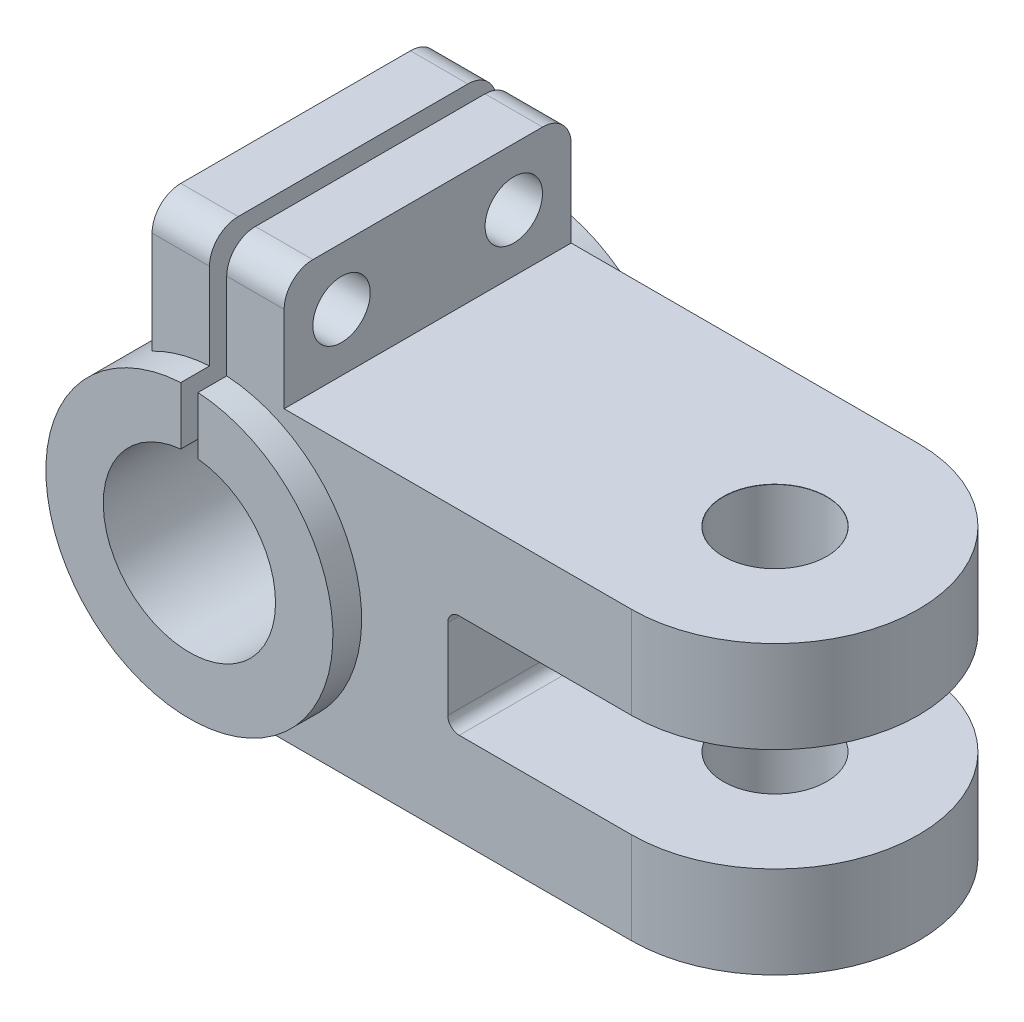
ISO-10303-21;
HEADER;
FILE_DESCRIPTION(('STEP AP214'),'2;1');
FILE_NAME('part.step','',(''),(''),'','','');
FILE_SCHEMA(('AUTOMOTIVE_DESIGN { 1 0 10303 214 1 1 1 1 }'));
ENDSEC;
DATA;
#1=APPLICATION_CONTEXT('core data for automotive mechanical design processes');
#2=APPLICATION_PROTOCOL_DEFINITION('international standard','automotive_design',2000,#1);
#3=PRODUCT_CONTEXT('',#1,'mechanical');
#4=PRODUCT('Part','Part','',(#3));
#5=PRODUCT_RELATED_PRODUCT_CATEGORY('part','',(#4));
#6=PRODUCT_DEFINITION_FORMATION('','',#4);
#7=PRODUCT_DEFINITION_CONTEXT('part definition',#1,'design');
#8=PRODUCT_DEFINITION('design','',#6,#7);
#9=PRODUCT_DEFINITION_SHAPE('','',#8);
#10=(LENGTH_UNIT() NAMED_UNIT(*) SI_UNIT(.MILLI.,.METRE.));
#11=(NAMED_UNIT(*) PLANE_ANGLE_UNIT() SI_UNIT($,.RADIAN.));
#12=(NAMED_UNIT(*) SI_UNIT($,.STERADIAN.) SOLID_ANGLE_UNIT());
#13=UNCERTAINTY_MEASURE_WITH_UNIT(LENGTH_MEASURE(1.E-05),#10,'distance_accuracy_value','');
#14=(GEOMETRIC_REPRESENTATION_CONTEXT(3) GLOBAL_UNCERTAINTY_ASSIGNED_CONTEXT((#13)) GLOBAL_UNIT_ASSIGNED_CONTEXT((#10,
#11,#12)) REPRESENTATION_CONTEXT('',''));
#15=CARTESIAN_POINT('',(0.,0.,0.));
#16=DIRECTION('',(0.,0.,1.));
#17=DIRECTION('',(1.,0.,0.));
#18=AXIS2_PLACEMENT_3D('',#15,#16,#17);
#19=CARTESIAN_POINT('',(0.,8.99999999999999,25.));
#20=DIRECTION('',(0.,-1.,0.));
#21=DIRECTION('',(1.,0.,0.));
#22=AXIS2_PLACEMENT_3D('',#19,#20,#21);
#23=PLANE('',#22);
#24=CARTESIAN_POINT('',(71.9999969609067,9.00000000000003,6.74475313169785E-07));
#25=DIRECTION('',(0.,-1.,0.));
#26=DIRECTION('',(1.,0.,0.));
#27=AXIS2_PLACEMENT_3D('',#24,#25,#26);
#28=CIRCLE('',#27,9.);
#29=CARTESIAN_POINT('',(80.9999969609067,9.00000000000004,6.74475313169785E-07));
#30=VERTEX_POINT('',#29);
#31=EDGE_CURVE('E413',#30,#30,#28,.T.);
#32=ORIENTED_EDGE('',*,*,#31,.F.);
#33=EDGE_LOOP('',(#32));
#34=FACE_BOUND('',#33,.T.);
#35=CARTESIAN_POINT('',(71.9999969609066,9.00000000000001,0.));
#36=DIRECTION('',(0.,-1.,0.));
#37=DIRECTION('',(1.,0.,0.));
#38=AXIS2_PLACEMENT_3D('',#35,#36,#37);
#39=CIRCLE('',#38,25.);
#40=CARTESIAN_POINT('',(71.9999969609066,9.00000000000003,-25.));
#41=VERTEX_POINT('',#40);
#42=CARTESIAN_POINT('',(71.9999969609066,9.00000000000003,25.));
#43=VERTEX_POINT('',#42);
#44=EDGE_CURVE('E450',#41,#43,#39,.T.);
#45=ORIENTED_EDGE('',*,*,#44,.T.);
#46=DIRECTION('',(-1.,0.,0.));
#47=VECTOR('',#46,1.);
#48=CARTESIAN_POINT('',(0.,8.99999999999999,25.));
#49=LINE('',#48,#47);
#50=CARTESIAN_POINT('',(42.,9.00000000000001,25.));
#51=VERTEX_POINT('',#50);
#52=EDGE_CURVE('E323',#43,#51,#49,.T.);
#53=ORIENTED_EDGE('',*,*,#52,.T.);
#54=DIRECTION('',(0.,0.,-1.));
#55=VECTOR('',#54,1.);
#56=CARTESIAN_POINT('',(42.,9.00000000000001,25.));
#57=LINE('',#56,#55);
#58=CARTESIAN_POINT('',(42.,9.00000000000001,-25.));
#59=VERTEX_POINT('',#58);
#60=EDGE_CURVE('E239',#51,#59,#57,.T.);
#61=ORIENTED_EDGE('',*,*,#60,.T.);
#62=DIRECTION('',(-1.,0.,0.));
#63=VECTOR('',#62,1.);
#64=CARTESIAN_POINT('',(0.,8.99999999999999,-25.));
#65=LINE('',#64,#63);
#66=EDGE_CURVE('E343',#41,#59,#65,.T.);
#67=ORIENTED_EDGE('',*,*,#66,.F.);
#68=EDGE_LOOP('',(#45,#53,#61,#67));
#69=FACE_BOUND('',#68,.T.);
#70=ADVANCED_FACE('F42',(#34,#69),#23,.T.);
#71=CARTESIAN_POINT('',(0.,25.,25.));
#72=DIRECTION('',(0.,-1.,0.));
#73=DIRECTION('',(1.,0.,0.));
#74=AXIS2_PLACEMENT_3D('',#71,#72,#73);
#75=PLANE('',#74);
#76=CARTESIAN_POINT('',(71.9999969609067,25.0000000000001,6.74475313169785E-07));
#77=DIRECTION('',(0.,1.,0.));
#78=DIRECTION('',(0.,0.,1.));
#79=AXIS2_PLACEMENT_3D('',#76,#77,#78);
#80=CIRCLE('',#79,9.02500000000001);
#81=CARTESIAN_POINT('',(71.9999969609067,25.0000000000001,9.02500067447532));
#82=VERTEX_POINT('',#81);
#83=EDGE_CURVE('E427',#82,#82,#80,.T.);
#84=ORIENTED_EDGE('',*,*,#83,.F.);
#85=EDGE_LOOP('',(#84));
#86=FACE_BOUND('',#85,.T.);
#87=CARTESIAN_POINT('',(71.9999969609066,25.0000000000001,0.));
#88=DIRECTION('',(0.,-1.,0.));
#89=DIRECTION('',(1.,0.,0.));
#90=AXIS2_PLACEMENT_3D('',#87,#88,#89);
#91=CIRCLE('',#90,25.);
#92=CARTESIAN_POINT('',(71.9999969609066,25.0000000000001,-25.));
#93=VERTEX_POINT('',#92);
#94=CARTESIAN_POINT('',(71.9999969609066,25.0000000000001,25.));
#95=VERTEX_POINT('',#94);
#96=EDGE_CURVE('E452',#93,#95,#91,.T.);
#97=ORIENTED_EDGE('',*,*,#96,.F.);
#98=DIRECTION('',(-1.,0.,0.));
#99=VECTOR('',#98,1.);
#100=CARTESIAN_POINT('',(0.,25.,-25.));
#101=LINE('',#100,#99);
#102=CARTESIAN_POINT('',(11.5,25.,-25.));
#103=VERTEX_POINT('',#102);
#104=EDGE_CURVE('E346',#93,#103,#101,.T.);
#105=ORIENTED_EDGE('',*,*,#104,.T.);
#106=DIRECTION('',(0.,0.,-1.));
#107=VECTOR('',#106,1.);
#108=CARTESIAN_POINT('',(11.5,25.,25.));
#109=LINE('',#108,#107);
#110=CARTESIAN_POINT('',(11.5,25.,25.));
#111=VERTEX_POINT('',#110);
#112=EDGE_CURVE('E244',#111,#103,#109,.T.);
#113=ORIENTED_EDGE('',*,*,#112,.F.);
#114=DIRECTION('',(-1.,0.,0.));
#115=VECTOR('',#114,1.);
#116=CARTESIAN_POINT('',(0.,25.,25.));
#117=LINE('',#116,#115);
#118=EDGE_CURVE('E317',#95,#111,#117,.T.);
#119=ORIENTED_EDGE('',*,*,#118,.F.);
#120=EDGE_LOOP('',(#97,#105,#113,#119));
#121=FACE_BOUND('',#120,.T.);
#122=ADVANCED_FACE('F473',(#86,#121),#75,.F.);
#123=CARTESIAN_POINT('',(0.,-25.,25.));
#124=DIRECTION('',(0.,1.,0.));
#125=DIRECTION('',(0.,0.,1.));
#126=AXIS2_PLACEMENT_3D('',#123,#124,#125);
#127=PLANE('',#126);
#128=CARTESIAN_POINT('',(71.9999969609067,-25.,6.74475313169785E-07));
#129=DIRECTION('',(0.,1.,0.));
#130=DIRECTION('',(0.,0.,1.));
#131=AXIS2_PLACEMENT_3D('',#128,#129,#130);
#132=CIRCLE('',#131,8.99999999999999);
#133=CARTESIAN_POINT('',(71.9999969609067,-25.,9.00000067447531));
#134=VERTEX_POINT('',#133);
#135=EDGE_CURVE('E419',#134,#134,#132,.T.);
#136=ORIENTED_EDGE('',*,*,#135,.T.);
#137=EDGE_LOOP('',(#136));
#138=FACE_BOUND('',#137,.T.);
#139=CARTESIAN_POINT('',(71.9999969609067,-25.,0.));
#140=DIRECTION('',(0.,1.,0.));
#141=DIRECTION('',(0.,0.,1.));
#142=AXIS2_PLACEMENT_3D('',#139,#140,#141);
#143=CIRCLE('',#142,25.);
#144=CARTESIAN_POINT('',(71.9999969609067,-25.,25.));
#145=VERTEX_POINT('',#144);
#146=CARTESIAN_POINT('',(71.9999969609067,-25.,-25.));
#147=VERTEX_POINT('',#146);
#148=EDGE_CURVE('E455',#145,#147,#143,.T.);
#149=ORIENTED_EDGE('',*,*,#148,.F.);
#150=DIRECTION('',(1.,0.,0.));
#151=VECTOR('',#150,1.);
#152=CARTESIAN_POINT('',(0.,-25.,25.));
#153=LINE('',#152,#151);
#154=CARTESIAN_POINT('',(0.,-25.,25.));
#155=VERTEX_POINT('',#154);
#156=EDGE_CURVE('E330',#155,#145,#153,.T.);
#157=ORIENTED_EDGE('',*,*,#156,.F.);
#158=DIRECTION('',(0.,0.,-1.));
#159=VECTOR('',#158,1.);
#160=CARTESIAN_POINT('',(0.,-25.,25.));
#161=LINE('',#160,#159);
#162=CARTESIAN_POINT('',(0.,-25.,-25.));
#163=VERTEX_POINT('',#162);
#164=EDGE_CURVE('E375',#155,#163,#161,.T.);
#165=ORIENTED_EDGE('',*,*,#164,.T.);
#166=DIRECTION('',(1.,0.,0.));
#167=VECTOR('',#166,1.);
#168=CARTESIAN_POINT('',(0.,-25.,-25.));
#169=LINE('',#168,#167);
#170=EDGE_CURVE('E357',#163,#147,#169,.T.);
#171=ORIENTED_EDGE('',*,*,#170,.T.);
#172=EDGE_LOOP('',(#149,#157,#165,#171));
#173=FACE_BOUND('',#172,.T.);
#174=ADVANCED_FACE('F491',(#138,#173),#127,.F.);
#175=CARTESIAN_POINT('',(0.,-8.99999999999997,25.));
#176=DIRECTION('',(0.,-1.,0.));
#177=DIRECTION('',(1.,0.,0.));
#178=AXIS2_PLACEMENT_3D('',#175,#176,#177);
#179=PLANE('',#178);
#180=CARTESIAN_POINT('',(71.9999969609067,-8.99999999999996,6.74475313169785E-07));
#181=DIRECTION('',(0.,-1.,0.));
#182=DIRECTION('',(1.,0.,0.));
#183=AXIS2_PLACEMENT_3D('',#180,#181,#182);
#184=CIRCLE('',#183,9.);
#185=CARTESIAN_POINT('',(80.9999969609067,-8.99999999999996,6.74475313169785E-07));
#186=VERTEX_POINT('',#185);
#187=EDGE_CURVE('E415',#186,#186,#184,.T.);
#188=ORIENTED_EDGE('',*,*,#187,.T.);
#189=EDGE_LOOP('',(#188));
#190=FACE_BOUND('',#189,.T.);
#191=CARTESIAN_POINT('',(71.9999969609066,-8.99999999999995,0.));
#192=DIRECTION('',(0.,-1.,0.));
#193=DIRECTION('',(1.,0.,0.));
#194=AXIS2_PLACEMENT_3D('',#191,#192,#193);
#195=CIRCLE('',#194,25.);
#196=CARTESIAN_POINT('',(71.9999969609066,-8.99999999999996,-25.));
#197=VERTEX_POINT('',#196);
#198=CARTESIAN_POINT('',(71.9999969609066,-8.99999999999996,25.));
#199=VERTEX_POINT('',#198);
#200=EDGE_CURVE('E457',#197,#199,#195,.T.);
#201=ORIENTED_EDGE('',*,*,#200,.F.);
#202=DIRECTION('',(-1.,0.,0.));
#203=VECTOR('',#202,1.);
#204=CARTESIAN_POINT('',(0.,-8.99999999999997,-25.));
#205=LINE('',#204,#203);
#206=CARTESIAN_POINT('',(42.,-8.99999999999996,-25.));
#207=VERTEX_POINT('',#206);
#208=EDGE_CURVE('E360',#197,#207,#205,.T.);
#209=ORIENTED_EDGE('',*,*,#208,.T.);
#210=DIRECTION('',(0.,0.,-1.));
#211=VECTOR('',#210,1.);
#212=CARTESIAN_POINT('',(42.,-8.99999999999996,25.));
#213=LINE('',#212,#211);
#214=CARTESIAN_POINT('',(42.,-8.99999999999996,25.));
#215=VERTEX_POINT('',#214);
#216=EDGE_CURVE('E372',#215,#207,#213,.T.);
#217=ORIENTED_EDGE('',*,*,#216,.F.);
#218=DIRECTION('',(-1.,0.,0.));
#219=VECTOR('',#218,1.);
#220=CARTESIAN_POINT('',(0.,-8.99999999999997,25.));
#221=LINE('',#220,#219);
#222=EDGE_CURVE('E333',#199,#215,#221,.T.);
#223=ORIENTED_EDGE('',*,*,#222,.F.);
#224=EDGE_LOOP('',(#201,#209,#217,#223));
#225=FACE_BOUND('',#224,.T.);
#226=ADVANCED_FACE('F560',(#190,#225),#179,.F.);
#227=CARTESIAN_POINT('',(0.,45.,25.));
#228=DIRECTION('',(0.,1.,0.));
#229=DIRECTION('',(-1.,0.,0.));
#230=AXIS2_PLACEMENT_3D('',#227,#228,#229);
#231=PLANE('',#230);
#232=DIRECTION('',(0.,0.,1.));
#233=VECTOR('',#232,1.);
#234=CARTESIAN_POINT('',(-1.5,45.,-30.));
#235=LINE('',#234,#233);
#236=CARTESIAN_POINT('',(-1.5,45.,-20.));
#237=VERTEX_POINT('',#236);
#238=CARTESIAN_POINT('',(-1.5,45.,20.));
#239=VERTEX_POINT('',#238);
#240=EDGE_CURVE('E306',#237,#239,#235,.T.);
#241=ORIENTED_EDGE('',*,*,#240,.F.);
#242=DIRECTION('',(1.,0.,0.));
#243=VECTOR('',#242,1.);
#244=CARTESIAN_POINT('',(-11.5,45.,-20.));
#245=LINE('',#244,#243);
#246=CARTESIAN_POINT('',(-11.5,45.,-20.));
#247=VERTEX_POINT('',#246);
#248=EDGE_CURVE('E276',#237,#247,#245,.F.);
#249=ORIENTED_EDGE('',*,*,#248,.T.);
#250=DIRECTION('',(0.,0.,-1.));
#251=VECTOR('',#250,1.);
#252=CARTESIAN_POINT('',(-11.5,45.,25.));
#253=LINE('',#252,#251);
#254=CARTESIAN_POINT('',(-11.5,45.,20.));
#255=VERTEX_POINT('',#254);
#256=EDGE_CURVE('E381',#255,#247,#253,.T.);
#257=ORIENTED_EDGE('',*,*,#256,.F.);
#258=DIRECTION('',(1.,0.,0.));
#259=VECTOR('',#258,1.);
#260=CARTESIAN_POINT('',(0.,45.,20.));
#261=LINE('',#260,#259);
#262=EDGE_CURVE('E273',#255,#239,#261,.T.);
#263=ORIENTED_EDGE('',*,*,#262,.T.);
#264=EDGE_LOOP('',(#241,#249,#257,#263));
#265=FACE_BOUND('',#264,.T.);
#266=ADVANCED_FACE('F528',(#265),#231,.T.);
#267=CARTESIAN_POINT('',(0.,0.,25.));
#268=DIRECTION('',(0.,0.,1.));
#269=DIRECTION('',(1.,0.,0.));
#270=AXIS2_PLACEMENT_3D('',#267,#268,#269);
#271=PLANE('',#270);
#272=DIRECTION('',(0.,-1.,0.));
#273=VECTOR('',#272,1.);
#274=CARTESIAN_POINT('',(-1.5,0.,25.));
#275=LINE('',#274,#273);
#276=CARTESIAN_POINT('',(-1.5,40.,25.));
#277=VERTEX_POINT('',#276);
#278=CARTESIAN_POINT('',(-1.5,24.9549594269356,25.));
#279=VERTEX_POINT('',#278);
#280=EDGE_CURVE('E401',#277,#279,#275,.T.);
#281=ORIENTED_EDGE('',*,*,#280,.F.);
#282=DIRECTION('',(1.,0.,0.));
#283=VECTOR('',#282,1.);
#284=CARTESIAN_POINT('',(0.,40.,25.));
#285=LINE('',#284,#283);
#286=CARTESIAN_POINT('',(-11.5,40.,25.));
#287=VERTEX_POINT('',#286);
#288=EDGE_CURVE('E282',#277,#287,#285,.F.);
#289=ORIENTED_EDGE('',*,*,#288,.T.);
#290=DIRECTION('',(0.,-1.,0.));
#291=VECTOR('',#290,1.);
#292=CARTESIAN_POINT('',(-11.5,0.,25.));
#293=LINE('',#292,#291);
#294=CARTESIAN_POINT('',(-11.5,22.1979728804231,25.));
#295=VERTEX_POINT('',#294);
#296=EDGE_CURVE('E319',#287,#295,#293,.T.);
#297=ORIENTED_EDGE('',*,*,#296,.T.);
#298=CARTESIAN_POINT('',(0.,0.,25.));
#299=DIRECTION('',(0.,0.,1.));
#300=DIRECTION('',(1.,0.,0.));
#301=AXIS2_PLACEMENT_3D('',#298,#299,#300);
#302=CIRCLE('',#301,25.);
#303=EDGE_CURVE('E321',#279,#295,#302,.T.);
#304=ORIENTED_EDGE('',*,*,#303,.F.);
#305=EDGE_LOOP('',(#281,#289,#297,#304));
#306=FACE_BOUND('',#305,.T.);
#307=ADVANCED_FACE('F537',(#306),#271,.T.);
#308=CARTESIAN_POINT('',(0.,0.,-25.));
#309=DIRECTION('',(0.,0.,1.));
#310=DIRECTION('',(1.,0.,0.));
#311=AXIS2_PLACEMENT_3D('',#308,#309,#310);
#312=PLANE('',#311);
#313=DIRECTION('',(0.,-1.,0.));
#314=VECTOR('',#313,1.);
#315=CARTESIAN_POINT('',(-11.5,0.,-25.));
#316=LINE('',#315,#314);
#317=CARTESIAN_POINT('',(-11.5,40.,-25.));
#318=VERTEX_POINT('',#317);
#319=CARTESIAN_POINT('',(-11.5,22.1979728804231,-25.));
#320=VERTEX_POINT('',#319);
#321=EDGE_CURVE('E351',#318,#320,#316,.T.);
#322=ORIENTED_EDGE('',*,*,#321,.F.);
#323=DIRECTION('',(1.,0.,0.));
#324=VECTOR('',#323,1.);
#325=CARTESIAN_POINT('',(-1.5,40.,-25.));
#326=LINE('',#325,#324);
#327=CARTESIAN_POINT('',(-1.5,40.,-25.));
#328=VERTEX_POINT('',#327);
#329=EDGE_CURVE('E265',#318,#328,#326,.T.);
#330=ORIENTED_EDGE('',*,*,#329,.T.);
#331=DIRECTION('',(0.,-1.,0.));
#332=VECTOR('',#331,1.);
#333=CARTESIAN_POINT('',(-1.5,0.,-25.));
#334=LINE('',#333,#332);
#335=CARTESIAN_POINT('',(-1.5,24.9549594269356,-25.));
#336=VERTEX_POINT('',#335);
#337=EDGE_CURVE('E252',#328,#336,#334,.T.);
#338=ORIENTED_EDGE('',*,*,#337,.T.);
#339=CARTESIAN_POINT('',(0.,0.,-25.));
#340=DIRECTION('',(0.,0.,1.));
#341=DIRECTION('',(1.,0.,0.));
#342=AXIS2_PLACEMENT_3D('',#339,#340,#341);
#343=CIRCLE('',#342,25.);
#344=EDGE_CURVE('E353',#336,#320,#343,.T.);
#345=ORIENTED_EDGE('',*,*,#344,.T.);
#346=EDGE_LOOP('',(#322,#330,#338,#345));
#347=FACE_BOUND('',#346,.T.);
#348=ADVANCED_FACE('F509',(#347),#312,.F.);
#349=CARTESIAN_POINT('',(0.,0.,30.));
#350=DIRECTION('',(0.,0.,-1.));
#351=DIRECTION('',(-1.,0.,0.));
#352=AXIS2_PLACEMENT_3D('',#349,#350,#351);
#353=CYLINDRICAL_SURFACE('',#352,15.);
#354=DIRECTION('',(0.,0.,1.));
#355=VECTOR('',#354,1.);
#356=CARTESIAN_POINT('',(1.5,14.9248115565993,-30.));
#357=LINE('',#356,#355);
#358=CARTESIAN_POINT('',(1.5,14.9248115565993,-30.));
#359=VERTEX_POINT('',#358);
#360=CARTESIAN_POINT('',(1.5,14.9248115565993,30.));
#361=VERTEX_POINT('',#360);
#362=EDGE_CURVE('E224',#359,#361,#357,.T.);
#363=ORIENTED_EDGE('',*,*,#362,.F.);
#364=CARTESIAN_POINT('',(0.,0.,-30.));
#365=DIRECTION('',(0.,0.,1.));
#366=DIRECTION('',(1.,0.,0.));
#367=AXIS2_PLACEMENT_3D('',#364,#365,#366);
#368=CIRCLE('',#367,15.);
#369=CARTESIAN_POINT('',(-1.5,14.9248115565993,-30.));
#370=VERTEX_POINT('',#369);
#371=EDGE_CURVE('E232',#370,#359,#368,.T.);
#372=ORIENTED_EDGE('',*,*,#371,.F.);
#373=DIRECTION('',(0.,0.,1.));
#374=VECTOR('',#373,1.);
#375=CARTESIAN_POINT('',(-1.5,14.9248115565993,-30.));
#376=LINE('',#375,#374);
#377=CARTESIAN_POINT('',(-1.5,14.9248115565993,30.));
#378=VERTEX_POINT('',#377);
#379=EDGE_CURVE('E211',#370,#378,#376,.T.);
#380=ORIENTED_EDGE('',*,*,#379,.T.);
#381=CARTESIAN_POINT('',(0.,0.,30.));
#382=DIRECTION('',(0.,0.,1.));
#383=DIRECTION('',(1.,0.,0.));
#384=AXIS2_PLACEMENT_3D('',#381,#382,#383);
#385=CIRCLE('',#384,15.);
#386=EDGE_CURVE('E241',#378,#361,#385,.T.);
#387=ORIENTED_EDGE('',*,*,#386,.T.);
#388=EDGE_LOOP('',(#363,#372,#380,#387));
#389=FACE_BOUND('',#388,.T.);
#390=ADVANCED_FACE('F238',(#389),#353,.F.);
#391=CARTESIAN_POINT('',(0.,0.,30.));
#392=DIRECTION('',(0.,0.,-1.));
#393=DIRECTION('',(-1.,0.,0.));
#394=AXIS2_PLACEMENT_3D('',#391,#392,#393);
#395=CYLINDRICAL_SURFACE('',#394,25.);
#396=CARTESIAN_POINT('',(0.,0.,30.));
#397=DIRECTION('',(0.,0.,1.));
#398=DIRECTION('',(1.,0.,0.));
#399=AXIS2_PLACEMENT_3D('',#396,#397,#398);
#400=CIRCLE('',#399,25.);
#401=CARTESIAN_POINT('',(-1.5,24.9549594269356,30.));
#402=VERTEX_POINT('',#401);
#403=CARTESIAN_POINT('',(1.5,24.9549594269356,30.));
#404=VERTEX_POINT('',#403);
#405=EDGE_CURVE('E247',#402,#404,#400,.T.);
#406=ORIENTED_EDGE('',*,*,#405,.F.);
#407=DIRECTION('',(0.,0.,-1.));
#408=VECTOR('',#407,1.);
#409=CARTESIAN_POINT('',(-1.5,24.9549594269356,30.));
#410=LINE('',#409,#408);
#411=EDGE_CURVE('E344',#402,#279,#410,.T.);
#412=ORIENTED_EDGE('',*,*,#411,.T.);
#413=ORIENTED_EDGE('',*,*,#303,.T.);
#414=DIRECTION('',(0.,0.,-1.));
#415=VECTOR('',#414,1.);
#416=CARTESIAN_POINT('',(-11.5,22.1979728804231,25.));
#417=LINE('',#416,#415);
#418=EDGE_CURVE('E378',#295,#320,#417,.T.);
#419=ORIENTED_EDGE('',*,*,#418,.T.);
#420=ORIENTED_EDGE('',*,*,#344,.F.);
#421=CARTESIAN_POINT('',(-1.5,24.9549594269356,-30.));
#422=VERTEX_POINT('',#421);
#423=EDGE_CURVE('E398',#336,#422,#410,.T.);
#424=ORIENTED_EDGE('',*,*,#423,.T.);
#425=CARTESIAN_POINT('',(0.,0.,-30.));
#426=DIRECTION('',(0.,0.,1.));
#427=DIRECTION('',(1.,0.,0.));
#428=AXIS2_PLACEMENT_3D('',#425,#426,#427);
#429=CIRCLE('',#428,25.);
#430=CARTESIAN_POINT('',(1.5,24.9549594269356,-30.));
#431=VERTEX_POINT('',#430);
#432=EDGE_CURVE('E234',#422,#431,#429,.T.);
#433=ORIENTED_EDGE('',*,*,#432,.T.);
#434=DIRECTION('',(0.,0.,-1.));
#435=VECTOR('',#434,1.);
#436=CARTESIAN_POINT('',(1.5,24.9549594269356,30.));
#437=LINE('',#436,#435);
#438=CARTESIAN_POINT('',(1.5,24.9549594269356,-25.));
#439=VERTEX_POINT('',#438);
#440=EDGE_CURVE('E400',#431,#439,#437,.F.);
#441=ORIENTED_EDGE('',*,*,#440,.T.);
#442=EDGE_CURVE('E354',#163,#439,#343,.T.);
#443=ORIENTED_EDGE('',*,*,#442,.F.);
#444=ORIENTED_EDGE('',*,*,#164,.F.);
#445=CARTESIAN_POINT('',(1.5,24.9549594269356,25.));
#446=VERTEX_POINT('',#445);
#447=EDGE_CURVE('E327',#155,#446,#302,.T.);
#448=ORIENTED_EDGE('',*,*,#447,.T.);
#449=EDGE_CURVE('E396',#446,#404,#437,.F.);
#450=ORIENTED_EDGE('',*,*,#449,.T.);
#451=EDGE_LOOP('',(#406,#412,#413,#419,#420,#424,#433,#441,#443,#444,#448,#450));
#452=FACE_BOUND('',#451,.T.);
#453=ADVANCED_FACE('F393',(#452),#395,.T.);
#454=CARTESIAN_POINT('',(0.,0.,30.));
#455=DIRECTION('',(0.,0.,1.));
#456=DIRECTION('',(1.,0.,0.));
#457=AXIS2_PLACEMENT_3D('',#454,#455,#456);
#458=PLANE('',#457);
#459=DIRECTION('',(0.,-1.,0.));
#460=VECTOR('',#459,1.);
#461=CARTESIAN_POINT('',(-1.5,45.,30.));
#462=LINE('',#461,#460);
#463=EDGE_CURVE('E219',#402,#378,#462,.T.);
#464=ORIENTED_EDGE('',*,*,#463,.F.);
#465=ORIENTED_EDGE('',*,*,#405,.T.);
#466=DIRECTION('',(0.,1.,0.));
#467=VECTOR('',#466,1.);
#468=CARTESIAN_POINT('',(1.5,45.,30.));
#469=LINE('',#468,#467);
#470=EDGE_CURVE('E235',#361,#404,#469,.T.);
#471=ORIENTED_EDGE('',*,*,#470,.F.);
#472=ORIENTED_EDGE('',*,*,#386,.F.);
#473=EDGE_LOOP('',(#464,#465,#471,#472));
#474=FACE_BOUND('',#473,.T.);
#475=ADVANCED_FACE('F389',(#474),#458,.T.);
#476=CARTESIAN_POINT('',(0.,0.,-30.));
#477=DIRECTION('',(0.,0.,1.));
#478=DIRECTION('',(1.,0.,0.));
#479=AXIS2_PLACEMENT_3D('',#476,#477,#478);
#480=PLANE('',#479);
#481=ORIENTED_EDGE('',*,*,#432,.F.);
#482=DIRECTION('',(0.,-1.,0.));
#483=VECTOR('',#482,1.);
#484=CARTESIAN_POINT('',(-1.5,45.,-30.));
#485=LINE('',#484,#483);
#486=EDGE_CURVE('E216',#422,#370,#485,.T.);
#487=ORIENTED_EDGE('',*,*,#486,.T.);
#488=ORIENTED_EDGE('',*,*,#371,.T.);
#489=DIRECTION('',(0.,1.,0.));
#490=VECTOR('',#489,1.);
#491=CARTESIAN_POINT('',(1.5,45.,-30.));
#492=LINE('',#491,#490);
#493=EDGE_CURVE('E225',#359,#431,#492,.T.);
#494=ORIENTED_EDGE('',*,*,#493,.T.);
#495=EDGE_LOOP('',(#481,#487,#488,#494));
#496=FACE_BOUND('',#495,.T.);
#497=ADVANCED_FACE('F230',(#496),#480,.F.);
#498=CARTESIAN_POINT('',(42.,7.00000000000002,25.));
#499=DIRECTION('',(0.,0.,-1.));
#500=DIRECTION('',(-1.,0.,0.));
#501=AXIS2_PLACEMENT_3D('',#498,#499,#500);
#502=CYLINDRICAL_SURFACE('',#501,2.);
#503=CARTESIAN_POINT('',(42.,7.00000000000002,-25.));
#504=DIRECTION('',(0.,0.,1.));
#505=DIRECTION('',(1.,0.,0.));
#506=AXIS2_PLACEMENT_3D('',#503,#504,#505);
#507=CIRCLE('',#506,2.);
#508=CARTESIAN_POINT('',(40.,7.00000000000002,-25.));
#509=VERTEX_POINT('',#508);
#510=EDGE_CURVE('E340',#59,#509,#507,.T.);
#511=ORIENTED_EDGE('',*,*,#510,.F.);
#512=ORIENTED_EDGE('',*,*,#60,.F.);
#513=CARTESIAN_POINT('',(42.,7.00000000000002,25.));
#514=DIRECTION('',(0.,0.,1.));
#515=DIRECTION('',(1.,0.,0.));
#516=AXIS2_PLACEMENT_3D('',#513,#514,#515);
#517=CIRCLE('',#516,2.);
#518=CARTESIAN_POINT('',(40.,7.00000000000002,25.));
#519=VERTEX_POINT('',#518);
#520=EDGE_CURVE('E367',#51,#519,#517,.T.);
#521=ORIENTED_EDGE('',*,*,#520,.T.);
#522=DIRECTION('',(0.,0.,-1.));
#523=VECTOR('',#522,1.);
#524=CARTESIAN_POINT('',(40.,7.00000000000002,25.));
#525=LINE('',#524,#523);
#526=EDGE_CURVE('E339',#519,#509,#525,.T.);
#527=ORIENTED_EDGE('',*,*,#526,.T.);
#528=EDGE_LOOP('',(#511,#512,#521,#527));
#529=FACE_BOUND('',#528,.T.);
#530=ADVANCED_FACE('F497',(#529),#502,.F.);
#531=CARTESIAN_POINT('',(11.5,0.,25.));
#532=DIRECTION('',(1.,0.,0.));
#533=DIRECTION('',(0.,1.,0.));
#534=AXIS2_PLACEMENT_3D('',#531,#532,#533);
#535=PLANE('',#534);
#536=CARTESIAN_POINT('',(11.5,35.,-15.));
#537=DIRECTION('',(1.,0.,0.));
#538=DIRECTION('',(0.,1.,0.));
#539=AXIS2_PLACEMENT_3D('',#536,#537,#538);
#540=CIRCLE('',#539,4.99999999999999);
#541=CARTESIAN_POINT('',(11.5,40.,-15.));
#542=VERTEX_POINT('',#541);
#543=EDGE_CURVE('E260',#542,#542,#540,.T.);
#544=ORIENTED_EDGE('',*,*,#543,.F.);
#545=EDGE_LOOP('',(#544));
#546=FACE_BOUND('',#545,.T.);
#547=CARTESIAN_POINT('',(11.5,35.,15.));
#548=DIRECTION('',(1.,0.,0.));
#549=DIRECTION('',(0.,1.,0.));
#550=AXIS2_PLACEMENT_3D('',#547,#548,#549);
#551=CIRCLE('',#550,4.99999999999999);
#552=CARTESIAN_POINT('',(11.5,40.,15.));
#553=VERTEX_POINT('',#552);
#554=EDGE_CURVE('E430',#553,#553,#551,.T.);
#555=ORIENTED_EDGE('',*,*,#554,.F.);
#556=EDGE_LOOP('',(#555));
#557=FACE_BOUND('',#556,.T.);
#558=DIRECTION('',(0.,0.,-1.));
#559=VECTOR('',#558,1.);
#560=CARTESIAN_POINT('',(11.5,45.,25.));
#561=LINE('',#560,#559);
#562=CARTESIAN_POINT('',(11.5,45.,20.));
#563=VERTEX_POINT('',#562);
#564=CARTESIAN_POINT('',(11.5,45.,-20.));
#565=VERTEX_POINT('',#564);
#566=EDGE_CURVE('E314',#563,#565,#561,.T.);
#567=ORIENTED_EDGE('',*,*,#566,.F.);
#568=CARTESIAN_POINT('',(11.5,40.,20.));
#569=DIRECTION('',(1.,0.,0.));
#570=DIRECTION('',(0.,1.,0.));
#571=AXIS2_PLACEMENT_3D('',#568,#569,#570);
#572=CIRCLE('',#571,5.);
#573=CARTESIAN_POINT('',(11.5,40.,25.));
#574=VERTEX_POINT('',#573);
#575=EDGE_CURVE('E291',#563,#574,#572,.T.);
#576=ORIENTED_EDGE('',*,*,#575,.T.);
#577=DIRECTION('',(0.,-1.,0.));
#578=VECTOR('',#577,1.);
#579=CARTESIAN_POINT('',(11.5,0.,25.));
#580=LINE('',#579,#578);
#581=EDGE_CURVE('E312',#574,#111,#580,.T.);
#582=ORIENTED_EDGE('',*,*,#581,.T.);
#583=ORIENTED_EDGE('',*,*,#112,.T.);
#584=DIRECTION('',(0.,-1.,0.));
#585=VECTOR('',#584,1.);
#586=CARTESIAN_POINT('',(11.5,0.,-25.));
#587=LINE('',#586,#585);
#588=CARTESIAN_POINT('',(11.5,40.,-25.));
#589=VERTEX_POINT('',#588);
#590=EDGE_CURVE('E349',#589,#103,#587,.T.);
#591=ORIENTED_EDGE('',*,*,#590,.F.);
#592=CARTESIAN_POINT('',(11.5,40.,-20.));
#593=DIRECTION('',(1.,0.,0.));
#594=DIRECTION('',(0.,1.,0.));
#595=AXIS2_PLACEMENT_3D('',#592,#593,#594);
#596=CIRCLE('',#595,5.);
#597=EDGE_CURVE('E289',#589,#565,#596,.T.);
#598=ORIENTED_EDGE('',*,*,#597,.T.);
#599=EDGE_LOOP('',(#567,#576,#582,#583,#591,#598));
#600=FACE_BOUND('',#599,.T.);
#601=ADVANCED_FACE('F310',(#546,#557,#600),#535,.T.);
#602=DIRECTION('',(0.,0.,1.));
#603=VECTOR('',#602,1.);
#604=CARTESIAN_POINT('',(1.5,45.,-30.));
#605=LINE('',#604,#603);
#606=CARTESIAN_POINT('',(1.5,45.,-20.));
#607=VERTEX_POINT('',#606);
#608=CARTESIAN_POINT('',(1.5,45.,20.));
#609=VERTEX_POINT('',#608);
#610=EDGE_CURVE('E297',#607,#609,#605,.T.);
#611=ORIENTED_EDGE('',*,*,#610,.T.);
#612=DIRECTION('',(1.,0.,0.));
#613=VECTOR('',#612,1.);
#614=CARTESIAN_POINT('',(0.,45.,20.));
#615=LINE('',#614,#613);
#616=EDGE_CURVE('E286',#609,#563,#615,.T.);
#617=ORIENTED_EDGE('',*,*,#616,.T.);
#618=ORIENTED_EDGE('',*,*,#566,.T.);
#619=DIRECTION('',(1.,0.,0.));
#620=VECTOR('',#619,1.);
#621=CARTESIAN_POINT('',(1.5,45.,-20.));
#622=LINE('',#621,#620);
#623=EDGE_CURVE('E284',#565,#607,#622,.F.);
#624=ORIENTED_EDGE('',*,*,#623,.T.);
#625=EDGE_LOOP('',(#611,#617,#618,#624));
#626=FACE_BOUND('',#625,.T.);
#627=ADVANCED_FACE('F302',(#626),#231,.T.);
#628=CARTESIAN_POINT('',(-11.5,0.,25.));
#629=DIRECTION('',(1.,0.,0.));
#630=DIRECTION('',(0.,0.,-1.));
#631=AXIS2_PLACEMENT_3D('',#628,#629,#630);
#632=PLANE('',#631);
#633=CARTESIAN_POINT('',(-11.5,35.,-15.));
#634=DIRECTION('',(-1.,0.,0.));
#635=DIRECTION('',(0.,0.,1.));
#636=AXIS2_PLACEMENT_3D('',#633,#634,#635);
#637=CIRCLE('',#636,5.025);
#638=CARTESIAN_POINT('',(-11.5,35.,-9.975));
#639=VERTEX_POINT('',#638);
#640=EDGE_CURVE('E447',#639,#639,#637,.T.);
#641=ORIENTED_EDGE('',*,*,#640,.F.);
#642=EDGE_LOOP('',(#641));
#643=FACE_BOUND('',#642,.T.);
#644=CARTESIAN_POINT('',(-11.5,35.,15.));
#645=DIRECTION('',(-1.,0.,0.));
#646=DIRECTION('',(0.,0.,1.));
#647=AXIS2_PLACEMENT_3D('',#644,#645,#646);
#648=CIRCLE('',#647,5.025);
#649=CARTESIAN_POINT('',(-11.5,35.,20.025));
#650=VERTEX_POINT('',#649);
#651=EDGE_CURVE('E437',#650,#650,#648,.T.);
#652=ORIENTED_EDGE('',*,*,#651,.F.);
#653=EDGE_LOOP('',(#652));
#654=FACE_BOUND('',#653,.T.);
#655=ORIENTED_EDGE('',*,*,#256,.T.);
#656=CARTESIAN_POINT('',(-11.5,40.,-20.));
#657=DIRECTION('',(1.,0.,0.));
#658=DIRECTION('',(0.,0.,-1.));
#659=AXIS2_PLACEMENT_3D('',#656,#657,#658);
#660=CIRCLE('',#659,5.);
#661=EDGE_CURVE('E280',#247,#318,#660,.F.);
#662=ORIENTED_EDGE('',*,*,#661,.T.);
#663=ORIENTED_EDGE('',*,*,#321,.T.);
#664=ORIENTED_EDGE('',*,*,#418,.F.);
#665=ORIENTED_EDGE('',*,*,#296,.F.);
#666=CARTESIAN_POINT('',(-11.5,40.,20.));
#667=DIRECTION('',(1.,0.,0.));
#668=DIRECTION('',(0.,0.,-1.));
#669=AXIS2_PLACEMENT_3D('',#666,#667,#668);
#670=CIRCLE('',#669,5.);
#671=EDGE_CURVE('E278',#287,#255,#670,.F.);
#672=ORIENTED_EDGE('',*,*,#671,.T.);
#673=EDGE_LOOP('',(#655,#662,#663,#664,#665,#672));
#674=FACE_BOUND('',#673,.T.);
#675=ADVANCED_FACE('F524',(#643,#654,#674),#632,.F.);
#676=CARTESIAN_POINT('',(42.,-6.99999999999996,25.));
#677=DIRECTION('',(0.,0.,-1.));
#678=DIRECTION('',(-1.,0.,0.));
#679=AXIS2_PLACEMENT_3D('',#676,#677,#678);
#680=CYLINDRICAL_SURFACE('',#679,2.);
#681=CARTESIAN_POINT('',(42.,-6.99999999999996,-25.));
#682=DIRECTION('',(0.,0.,1.));
#683=DIRECTION('',(1.,0.,0.));
#684=AXIS2_PLACEMENT_3D('',#681,#682,#683);
#685=CIRCLE('',#684,2.);
#686=CARTESIAN_POINT('',(40.,-6.99999999999996,-25.));
#687=VERTEX_POINT('',#686);
#688=EDGE_CURVE('E362',#207,#687,#685,.F.);
#689=ORIENTED_EDGE('',*,*,#688,.T.);
#690=DIRECTION('',(0.,0.,-1.));
#691=VECTOR('',#690,1.);
#692=CARTESIAN_POINT('',(40.,-6.99999999999996,25.));
#693=LINE('',#692,#691);
#694=CARTESIAN_POINT('',(40.,-6.99999999999996,25.));
#695=VERTEX_POINT('',#694);
#696=EDGE_CURVE('E369',#695,#687,#693,.T.);
#697=ORIENTED_EDGE('',*,*,#696,.F.);
#698=CARTESIAN_POINT('',(42.,-6.99999999999996,25.));
#699=DIRECTION('',(0.,0.,1.));
#700=DIRECTION('',(1.,0.,0.));
#701=AXIS2_PLACEMENT_3D('',#698,#699,#700);
#702=CIRCLE('',#701,2.);
#703=EDGE_CURVE('E335',#215,#695,#702,.F.);
#704=ORIENTED_EDGE('',*,*,#703,.F.);
#705=ORIENTED_EDGE('',*,*,#216,.T.);
#706=EDGE_LOOP('',(#689,#697,#704,#705));
#707=FACE_BOUND('',#706,.T.);
#708=ADVANCED_FACE('F556',(#707),#680,.F.);
#709=CARTESIAN_POINT('',(40.,0.,25.));
#710=DIRECTION('',(-1.,0.,0.));
#711=DIRECTION('',(0.,-1.,0.));
#712=AXIS2_PLACEMENT_3D('',#709,#710,#711);
#713=PLANE('',#712);
#714=DIRECTION('',(0.,1.,0.));
#715=VECTOR('',#714,1.);
#716=CARTESIAN_POINT('',(40.,0.,-25.));
#717=LINE('',#716,#715);
#718=EDGE_CURVE('E364',#687,#509,#717,.T.);
#719=ORIENTED_EDGE('',*,*,#718,.T.);
#720=ORIENTED_EDGE('',*,*,#526,.F.);
#721=DIRECTION('',(0.,1.,0.));
#722=VECTOR('',#721,1.);
#723=CARTESIAN_POINT('',(40.,0.,25.));
#724=LINE('',#723,#722);
#725=EDGE_CURVE('E337',#695,#519,#724,.T.);
#726=ORIENTED_EDGE('',*,*,#725,.F.);
#727=ORIENTED_EDGE('',*,*,#696,.T.);
#728=EDGE_LOOP('',(#719,#720,#726,#727));
#729=FACE_BOUND('',#728,.T.);
#730=ADVANCED_FACE('F549',(#729),#713,.F.);
#731=ORIENTED_EDGE('',*,*,#581,.F.);
#732=DIRECTION('',(1.,0.,0.));
#733=VECTOR('',#732,1.);
#734=CARTESIAN_POINT('',(0.,40.,25.));
#735=LINE('',#734,#733);
#736=CARTESIAN_POINT('',(1.5,40.,25.));
#737=VERTEX_POINT('',#736);
#738=EDGE_CURVE('E65',#574,#737,#735,.F.);
#739=ORIENTED_EDGE('',*,*,#738,.T.);
#740=DIRECTION('',(0.,1.,0.));
#741=VECTOR('',#740,1.);
#742=CARTESIAN_POINT('',(1.5,0.,25.));
#743=LINE('',#742,#741);
#744=EDGE_CURVE('E298',#446,#737,#743,.T.);
#745=ORIENTED_EDGE('',*,*,#744,.F.);
#746=ORIENTED_EDGE('',*,*,#447,.F.);
#747=ORIENTED_EDGE('',*,*,#156,.T.);
#748=DIRECTION('',(0.,-1.,0.));
#749=VECTOR('',#748,1.);
#750=CARTESIAN_POINT('',(71.9999969609066,241.147848536153,25.));
#751=LINE('',#750,#749);
#752=EDGE_CURVE('E462',#199,#145,#751,.T.);
#753=ORIENTED_EDGE('',*,*,#752,.F.);
#754=ORIENTED_EDGE('',*,*,#222,.T.);
#755=ORIENTED_EDGE('',*,*,#703,.T.);
#756=ORIENTED_EDGE('',*,*,#725,.T.);
#757=ORIENTED_EDGE('',*,*,#520,.F.);
#758=ORIENTED_EDGE('',*,*,#52,.F.);
#759=EDGE_CURVE('E460',#95,#43,#751,.T.);
#760=ORIENTED_EDGE('',*,*,#759,.F.);
#761=ORIENTED_EDGE('',*,*,#118,.T.);
#762=EDGE_LOOP('',(#731,#739,#745,#746,#747,#753,#754,#755,#756,#757,#758,#760,#761));
#763=FACE_BOUND('',#762,.T.);
#764=ADVANCED_FACE('F315',(#763),#271,.T.);
#765=DIRECTION('',(0.,1.,0.));
#766=VECTOR('',#765,1.);
#767=CARTESIAN_POINT('',(1.5,0.,-25.));
#768=LINE('',#767,#766);
#769=CARTESIAN_POINT('',(1.5,40.,-25.));
#770=VERTEX_POINT('',#769);
#771=EDGE_CURVE('E250',#439,#770,#768,.T.);
#772=ORIENTED_EDGE('',*,*,#771,.T.);
#773=DIRECTION('',(1.,0.,0.));
#774=VECTOR('',#773,1.);
#775=CARTESIAN_POINT('',(11.5,40.,-25.));
#776=LINE('',#775,#774);
#777=EDGE_CURVE('E11',#770,#589,#776,.T.);
#778=ORIENTED_EDGE('',*,*,#777,.T.);
#779=ORIENTED_EDGE('',*,*,#590,.T.);
#780=ORIENTED_EDGE('',*,*,#104,.F.);
#781=DIRECTION('',(0.,-1.,0.));
#782=VECTOR('',#781,1.);
#783=CARTESIAN_POINT('',(71.9999969609066,241.147848536153,-25.));
#784=LINE('',#783,#782);
#785=EDGE_CURVE('E269',#93,#41,#784,.T.);
#786=ORIENTED_EDGE('',*,*,#785,.T.);
#787=ORIENTED_EDGE('',*,*,#66,.T.);
#788=ORIENTED_EDGE('',*,*,#510,.T.);
#789=ORIENTED_EDGE('',*,*,#718,.F.);
#790=ORIENTED_EDGE('',*,*,#688,.F.);
#791=ORIENTED_EDGE('',*,*,#208,.F.);
#792=EDGE_CURVE('E254',#197,#147,#784,.T.);
#793=ORIENTED_EDGE('',*,*,#792,.T.);
#794=ORIENTED_EDGE('',*,*,#170,.F.);
#795=ORIENTED_EDGE('',*,*,#442,.T.);
#796=EDGE_LOOP('',(#772,#778,#779,#780,#786,#787,#788,#789,#790,#791,#793,#794,#795));
#797=FACE_BOUND('',#796,.T.);
#798=ADVANCED_FACE('F477',(#797),#312,.F.);
#799=CARTESIAN_POINT('',(1.5,45.,-30.));
#800=DIRECTION('',(1.,0.,0.));
#801=DIRECTION('',(0.,1.,0.));
#802=AXIS2_PLACEMENT_3D('',#799,#800,#801);
#803=PLANE('',#802);
#804=CARTESIAN_POINT('',(1.5,35.,-15.));
#805=DIRECTION('',(1.,0.,0.));
#806=DIRECTION('',(0.,1.,0.));
#807=AXIS2_PLACEMENT_3D('',#804,#805,#806);
#808=CIRCLE('',#807,4.99999999999999);
#809=CARTESIAN_POINT('',(1.5,40.,-15.));
#810=VERTEX_POINT('',#809);
#811=EDGE_CURVE('E440',#810,#810,#808,.T.);
#812=ORIENTED_EDGE('',*,*,#811,.T.);
#813=EDGE_LOOP('',(#812));
#814=FACE_BOUND('',#813,.T.);
#815=CARTESIAN_POINT('',(1.5,35.,15.));
#816=DIRECTION('',(1.,0.,0.));
#817=DIRECTION('',(0.,1.,0.));
#818=AXIS2_PLACEMENT_3D('',#815,#816,#817);
#819=CIRCLE('',#818,4.99999999999999);
#820=CARTESIAN_POINT('',(1.5,40.,15.));
#821=VERTEX_POINT('',#820);
#822=EDGE_CURVE('E258',#821,#821,#819,.T.);
#823=ORIENTED_EDGE('',*,*,#822,.T.);
#824=EDGE_LOOP('',(#823));
#825=FACE_BOUND('',#824,.T.);
#826=ORIENTED_EDGE('',*,*,#744,.T.);
#827=CARTESIAN_POINT('',(1.5,40.,20.));
#828=DIRECTION('',(1.,0.,0.));
#829=DIRECTION('',(0.,1.,0.));
#830=AXIS2_PLACEMENT_3D('',#827,#828,#829);
#831=CIRCLE('',#830,5.);
#832=EDGE_CURVE('E50',#737,#609,#831,.F.);
#833=ORIENTED_EDGE('',*,*,#832,.T.);
#834=ORIENTED_EDGE('',*,*,#610,.F.);
#835=CARTESIAN_POINT('',(1.5,40.,-20.));
#836=DIRECTION('',(1.,0.,0.));
#837=DIRECTION('',(0.,1.,0.));
#838=AXIS2_PLACEMENT_3D('',#835,#836,#837);
#839=CIRCLE('',#838,5.);
#840=EDGE_CURVE('E57',#607,#770,#839,.F.);
#841=ORIENTED_EDGE('',*,*,#840,.T.);
#842=ORIENTED_EDGE('',*,*,#771,.F.);
#843=ORIENTED_EDGE('',*,*,#440,.F.);
#844=ORIENTED_EDGE('',*,*,#493,.F.);
#845=ORIENTED_EDGE('',*,*,#362,.T.);
#846=ORIENTED_EDGE('',*,*,#470,.T.);
#847=ORIENTED_EDGE('',*,*,#449,.F.);
#848=EDGE_LOOP('',(#826,#833,#834,#841,#842,#843,#844,#845,#846,#847));
#849=FACE_BOUND('',#848,.T.);
#850=ADVANCED_FACE('F296',(#814,#825,#849),#803,.F.);
#851=CARTESIAN_POINT('',(-1.5,45.,-30.));
#852=DIRECTION('',(-1.,0.,0.));
#853=DIRECTION('',(0.,-1.,0.));
#854=AXIS2_PLACEMENT_3D('',#851,#852,#853);
#855=PLANE('',#854);
#856=CARTESIAN_POINT('',(-1.5,35.,-15.));
#857=DIRECTION('',(-1.,0.,0.));
#858=DIRECTION('',(0.,-1.,0.));
#859=AXIS2_PLACEMENT_3D('',#856,#857,#858);
#860=CIRCLE('',#859,4.99999999999999);
#861=CARTESIAN_POINT('',(-1.5,30.,-15.));
#862=VERTEX_POINT('',#861);
#863=EDGE_CURVE('E263',#862,#862,#860,.T.);
#864=ORIENTED_EDGE('',*,*,#863,.T.);
#865=EDGE_LOOP('',(#864));
#866=FACE_BOUND('',#865,.T.);
#867=CARTESIAN_POINT('',(-1.5,35.,15.));
#868=DIRECTION('',(-1.,0.,0.));
#869=DIRECTION('',(0.,-1.,0.));
#870=AXIS2_PLACEMENT_3D('',#867,#868,#869);
#871=CIRCLE('',#870,4.99999999999999);
#872=CARTESIAN_POINT('',(-1.5,30.,15.));
#873=VERTEX_POINT('',#872);
#874=EDGE_CURVE('E255',#873,#873,#871,.T.);
#875=ORIENTED_EDGE('',*,*,#874,.T.);
#876=EDGE_LOOP('',(#875));
#877=FACE_BOUND('',#876,.T.);
#878=ORIENTED_EDGE('',*,*,#337,.F.);
#879=CARTESIAN_POINT('',(-1.5,40.,-20.));
#880=DIRECTION('',(-1.,0.,0.));
#881=DIRECTION('',(0.,-1.,0.));
#882=AXIS2_PLACEMENT_3D('',#879,#880,#881);
#883=CIRCLE('',#882,5.);
#884=EDGE_CURVE('E271',#328,#237,#883,.F.);
#885=ORIENTED_EDGE('',*,*,#884,.T.);
#886=ORIENTED_EDGE('',*,*,#240,.T.);
#887=CARTESIAN_POINT('',(-1.5,40.,20.));
#888=DIRECTION('',(-1.,0.,0.));
#889=DIRECTION('',(0.,-1.,0.));
#890=AXIS2_PLACEMENT_3D('',#887,#888,#889);
#891=CIRCLE('',#890,5.);
#892=EDGE_CURVE('E268',#239,#277,#891,.F.);
#893=ORIENTED_EDGE('',*,*,#892,.T.);
#894=ORIENTED_EDGE('',*,*,#280,.T.);
#895=ORIENTED_EDGE('',*,*,#411,.F.);
#896=ORIENTED_EDGE('',*,*,#463,.T.);
#897=ORIENTED_EDGE('',*,*,#379,.F.);
#898=ORIENTED_EDGE('',*,*,#486,.F.);
#899=ORIENTED_EDGE('',*,*,#423,.F.);
#900=EDGE_LOOP('',(#878,#885,#886,#893,#894,#895,#896,#897,#898,#899));
#901=FACE_BOUND('',#900,.T.);
#902=ADVANCED_FACE('F214',(#866,#877,#901),#855,.F.);
#903=CARTESIAN_POINT('',(71.9999969609067,25.0000000000001,6.74475313169785E-07));
#904=DIRECTION('',(0.,1.,0.));
#905=DIRECTION('',(0.,0.,1.));
#906=AXIS2_PLACEMENT_3D('',#903,#904,#905);
#907=CONICAL_SURFACE('',#906,9.02500000000001,0.785398163397518);
#908=CARTESIAN_POINT('',(71.9999969609067,24.9750000000001,6.74475313169785E-07));
#909=DIRECTION('',(0.,1.,0.));
#910=DIRECTION('',(0.,0.,1.));
#911=AXIS2_PLACEMENT_3D('',#908,#909,#910);
#912=CIRCLE('',#911,9.00000000000001);
#913=CARTESIAN_POINT('',(71.9999969609067,24.9750000000001,9.00000067447532));
#914=VERTEX_POINT('',#913);
#915=EDGE_CURVE('E424',#914,#914,#912,.T.);
#916=ORIENTED_EDGE('',*,*,#915,.F.);
#917=EDGE_LOOP('',(#916));
#918=FACE_BOUND('',#917,.T.);
#919=ORIENTED_EDGE('',*,*,#83,.T.);
#920=EDGE_LOOP('',(#919));
#921=FACE_BOUND('',#920,.T.);
#922=ADVANCED_FACE('F603',(#918,#921),#907,.F.);
#923=CARTESIAN_POINT('',(71.9999969609067,25.0000000000001,6.74475313169785E-07));
#924=DIRECTION('',(0.,1.,0.));
#925=DIRECTION('',(0.,0.,1.));
#926=AXIS2_PLACEMENT_3D('',#923,#924,#925);
#927=CYLINDRICAL_SURFACE('',#926,9.);
#928=ORIENTED_EDGE('',*,*,#31,.T.);
#929=EDGE_LOOP('',(#928));
#930=FACE_BOUND('',#929,.T.);
#931=ORIENTED_EDGE('',*,*,#915,.T.);
#932=EDGE_LOOP('',(#931));
#933=FACE_BOUND('',#932,.T.);
#934=ADVANCED_FACE('F608',(#930,#933),#927,.F.);
#935=ORIENTED_EDGE('',*,*,#135,.F.);
#936=EDGE_LOOP('',(#935));
#937=FACE_BOUND('',#936,.T.);
#938=ORIENTED_EDGE('',*,*,#187,.F.);
#939=EDGE_LOOP('',(#938));
#940=FACE_BOUND('',#939,.T.);
#941=ADVANCED_FACE('F767',(#937,#940),#927,.F.);
#942=CARTESIAN_POINT('',(-11.5,35.,15.));
#943=DIRECTION('',(-1.,0.,0.));
#944=DIRECTION('',(0.,0.,1.));
#945=AXIS2_PLACEMENT_3D('',#942,#943,#944);
#946=CYLINDRICAL_SURFACE('',#945,4.99999999999999);
#947=CARTESIAN_POINT('',(-11.475,35.,15.));
#948=DIRECTION('',(-1.,0.,0.));
#949=DIRECTION('',(0.,0.,1.));
#950=AXIS2_PLACEMENT_3D('',#947,#948,#949);
#951=CIRCLE('',#950,5.);
#952=CARTESIAN_POINT('',(-11.475,35.,20.));
#953=VERTEX_POINT('',#952);
#954=EDGE_CURVE('E259',#953,#953,#951,.T.);
#955=ORIENTED_EDGE('',*,*,#954,.T.);
#956=EDGE_LOOP('',(#955));
#957=FACE_BOUND('',#956,.T.);
#958=ORIENTED_EDGE('',*,*,#874,.F.);
#959=EDGE_LOOP('',(#958));
#960=FACE_BOUND('',#959,.T.);
#961=ADVANCED_FACE('F593',(#957,#960),#946,.F.);
#962=CARTESIAN_POINT('',(-11.5,35.,15.));
#963=DIRECTION('',(-1.,0.,0.));
#964=DIRECTION('',(0.,0.,1.));
#965=AXIS2_PLACEMENT_3D('',#962,#963,#964);
#966=CONICAL_SURFACE('',#965,5.025,0.785398163397518);
#967=ORIENTED_EDGE('',*,*,#954,.F.);
#968=EDGE_LOOP('',(#967));
#969=FACE_BOUND('',#968,.T.);
#970=ORIENTED_EDGE('',*,*,#651,.T.);
#971=EDGE_LOOP('',(#970));
#972=FACE_BOUND('',#971,.T.);
#973=ADVANCED_FACE('F591',(#969,#972),#966,.F.);
#974=ORIENTED_EDGE('',*,*,#554,.T.);
#975=EDGE_LOOP('',(#974));
#976=FACE_BOUND('',#975,.T.);
#977=ORIENTED_EDGE('',*,*,#822,.F.);
#978=EDGE_LOOP('',(#977));
#979=FACE_BOUND('',#978,.T.);
#980=ADVANCED_FACE('F587',(#976,#979),#946,.F.);
#981=CARTESIAN_POINT('',(-11.5,35.,-15.));
#982=DIRECTION('',(-1.,0.,0.));
#983=DIRECTION('',(0.,0.,1.));
#984=AXIS2_PLACEMENT_3D('',#981,#982,#983);
#985=CYLINDRICAL_SURFACE('',#984,4.99999999999999);
#986=ORIENTED_EDGE('',*,*,#543,.T.);
#987=EDGE_LOOP('',(#986));
#988=FACE_BOUND('',#987,.T.);
#989=ORIENTED_EDGE('',*,*,#811,.F.);
#990=EDGE_LOOP('',(#989));
#991=FACE_BOUND('',#990,.T.);
#992=ADVANCED_FACE('F590',(#988,#991),#985,.F.);
#993=CARTESIAN_POINT('',(-11.475,35.,-15.));
#994=DIRECTION('',(-1.,0.,0.));
#995=DIRECTION('',(0.,0.,1.));
#996=AXIS2_PLACEMENT_3D('',#993,#994,#995);
#997=CIRCLE('',#996,5.);
#998=CARTESIAN_POINT('',(-11.475,35.,-10.));
#999=VERTEX_POINT('',#998);
#1000=EDGE_CURVE('E264',#999,#999,#997,.T.);
#1001=ORIENTED_EDGE('',*,*,#1000,.T.);
#1002=EDGE_LOOP('',(#1001));
#1003=FACE_BOUND('',#1002,.T.);
#1004=ORIENTED_EDGE('',*,*,#863,.F.);
#1005=EDGE_LOOP('',(#1004));
#1006=FACE_BOUND('',#1005,.T.);
#1007=ADVANCED_FACE('F725',(#1003,#1006),#985,.F.);
#1008=CARTESIAN_POINT('',(-11.5,35.,-15.));
#1009=DIRECTION('',(-1.,0.,0.));
#1010=DIRECTION('',(0.,0.,1.));
#1011=AXIS2_PLACEMENT_3D('',#1008,#1009,#1010);
#1012=CONICAL_SURFACE('',#1011,5.025,0.785398163397518);
#1013=ORIENTED_EDGE('',*,*,#1000,.F.);
#1014=EDGE_LOOP('',(#1013));
#1015=FACE_BOUND('',#1014,.T.);
#1016=ORIENTED_EDGE('',*,*,#640,.T.);
#1017=EDGE_LOOP('',(#1016));
#1018=FACE_BOUND('',#1017,.T.);
#1019=ADVANCED_FACE('F695',(#1015,#1018),#1012,.F.);
#1020=CARTESIAN_POINT('',(71.9999969609065,241.147848536153,0.));
#1021=DIRECTION('',(0.,-1.,0.));
#1022=DIRECTION('',(1.,0.,0.));
#1023=AXIS2_PLACEMENT_3D('',#1020,#1021,#1022);
#1024=CYLINDRICAL_SURFACE('',#1023,25.);
#1025=ORIENTED_EDGE('',*,*,#752,.T.);
#1026=ORIENTED_EDGE('',*,*,#148,.T.);
#1027=ORIENTED_EDGE('',*,*,#792,.F.);
#1028=ORIENTED_EDGE('',*,*,#200,.T.);
#1029=EDGE_LOOP('',(#1025,#1026,#1027,#1028));
#1030=FACE_BOUND('',#1029,.T.);
#1031=ADVANCED_FACE('F561',(#1030),#1024,.T.);
#1032=ORIENTED_EDGE('',*,*,#759,.T.);
#1033=ORIENTED_EDGE('',*,*,#44,.F.);
#1034=ORIENTED_EDGE('',*,*,#785,.F.);
#1035=ORIENTED_EDGE('',*,*,#96,.T.);
#1036=EDGE_LOOP('',(#1032,#1033,#1034,#1035));
#1037=FACE_BOUND('',#1036,.T.);
#1038=ADVANCED_FACE('F468',(#1037),#1024,.T.);
#1039=CARTESIAN_POINT('',(0.,40.,-20.));
#1040=DIRECTION('',(-1.,0.,0.));
#1041=DIRECTION('',(0.,-1.,0.));
#1042=AXIS2_PLACEMENT_3D('',#1039,#1040,#1041);
#1043=CYLINDRICAL_SURFACE('',#1042,5.);
#1044=ORIENTED_EDGE('',*,*,#661,.F.);
#1045=ORIENTED_EDGE('',*,*,#248,.F.);
#1046=ORIENTED_EDGE('',*,*,#884,.F.);
#1047=ORIENTED_EDGE('',*,*,#329,.F.);
#1048=EDGE_LOOP('',(#1044,#1045,#1046,#1047));
#1049=FACE_BOUND('',#1048,.T.);
#1050=ADVANCED_FACE('F510',(#1049),#1043,.T.);
#1051=CARTESIAN_POINT('',(0.,40.,20.));
#1052=DIRECTION('',(1.,0.,0.));
#1053=DIRECTION('',(0.,1.,0.));
#1054=AXIS2_PLACEMENT_3D('',#1051,#1052,#1053);
#1055=CYLINDRICAL_SURFACE('',#1054,5.);
#1056=ORIENTED_EDGE('',*,*,#671,.F.);
#1057=ORIENTED_EDGE('',*,*,#288,.F.);
#1058=ORIENTED_EDGE('',*,*,#892,.F.);
#1059=ORIENTED_EDGE('',*,*,#262,.F.);
#1060=EDGE_LOOP('',(#1056,#1057,#1058,#1059));
#1061=FACE_BOUND('',#1060,.T.);
#1062=ADVANCED_FACE('F484',(#1061),#1055,.T.);
#1063=CARTESIAN_POINT('',(0.,40.,20.));
#1064=DIRECTION('',(1.,0.,0.));
#1065=DIRECTION('',(0.,1.,0.));
#1066=AXIS2_PLACEMENT_3D('',#1063,#1064,#1065);
#1067=CYLINDRICAL_SURFACE('',#1066,5.);
#1068=ORIENTED_EDGE('',*,*,#832,.F.);
#1069=ORIENTED_EDGE('',*,*,#738,.F.);
#1070=ORIENTED_EDGE('',*,*,#575,.F.);
#1071=ORIENTED_EDGE('',*,*,#616,.F.);
#1072=EDGE_LOOP('',(#1068,#1069,#1070,#1071));
#1073=FACE_BOUND('',#1072,.T.);
#1074=ADVANCED_FACE('F308',(#1073),#1067,.T.);
#1075=CARTESIAN_POINT('',(0.,40.,-20.));
#1076=DIRECTION('',(-1.,0.,0.));
#1077=DIRECTION('',(0.,-1.,0.));
#1078=AXIS2_PLACEMENT_3D('',#1075,#1076,#1077);
#1079=CYLINDRICAL_SURFACE('',#1078,5.);
#1080=ORIENTED_EDGE('',*,*,#840,.F.);
#1081=ORIENTED_EDGE('',*,*,#623,.F.);
#1082=ORIENTED_EDGE('',*,*,#597,.F.);
#1083=ORIENTED_EDGE('',*,*,#777,.F.);
#1084=EDGE_LOOP('',(#1080,#1081,#1082,#1083));
#1085=FACE_BOUND('',#1084,.T.);
#1086=ADVANCED_FACE('F44',(#1085),#1079,.T.);
#1087=CLOSED_SHELL('',(#70,#122,#174,#226,#266,#307,#348,#390,#453,#475,#497,#530,#601,#627,
#675,#708,#730,#764,#798,#850,#902,#922,#934,#941,#961,#973,#980,#992,#1007,#1019,#1031,#1038,
#1050,#1062,#1074,#1086));
#1088=MANIFOLD_SOLID_BREP('B2',#1087);
#1089=ADVANCED_BREP_SHAPE_REPRESENTATION('',(#18,#1088),#14);
#1090=SHAPE_DEFINITION_REPRESENTATION(#9,#1089);
ENDSEC;
END-ISO-10303-21;
